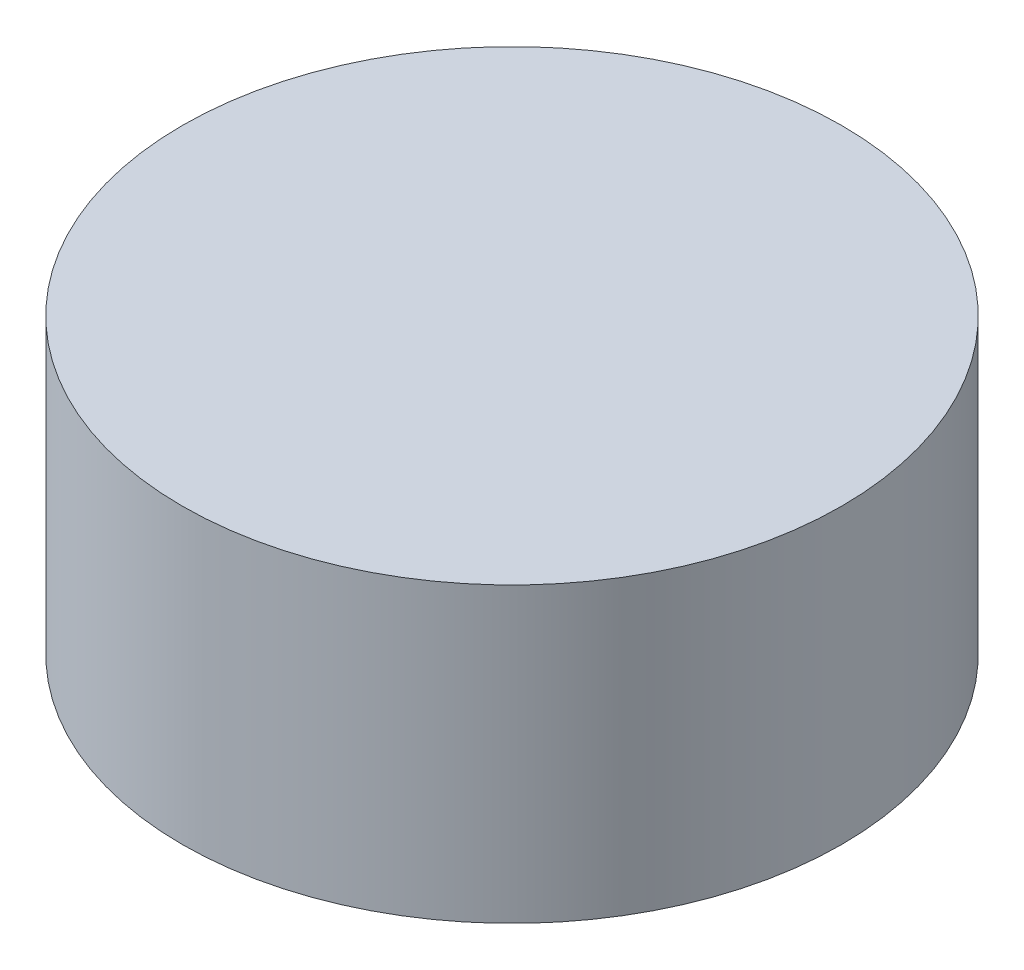
ISO-10303-21;
HEADER;
FILE_DESCRIPTION(('STEP AP214'),'2;1');
FILE_NAME('part.step','',(''),(''),'','','');
FILE_SCHEMA(('AUTOMOTIVE_DESIGN { 1 0 10303 214 1 1 1 1 }'));
ENDSEC;
DATA;
#1=APPLICATION_CONTEXT('core data for automotive mechanical design processes');
#2=APPLICATION_PROTOCOL_DEFINITION('international standard','automotive_design',2000,#1);
#3=PRODUCT_CONTEXT('',#1,'mechanical');
#4=PRODUCT('Part','Part','',(#3));
#5=PRODUCT_RELATED_PRODUCT_CATEGORY('part','',(#4));
#6=PRODUCT_DEFINITION_FORMATION('','',#4);
#7=PRODUCT_DEFINITION_CONTEXT('part definition',#1,'design');
#8=PRODUCT_DEFINITION('design','',#6,#7);
#9=PRODUCT_DEFINITION_SHAPE('','',#8);
#10=(LENGTH_UNIT() NAMED_UNIT(*) SI_UNIT(.MILLI.,.METRE.));
#11=(NAMED_UNIT(*) PLANE_ANGLE_UNIT() SI_UNIT($,.RADIAN.));
#12=(NAMED_UNIT(*) SI_UNIT($,.STERADIAN.) SOLID_ANGLE_UNIT());
#13=UNCERTAINTY_MEASURE_WITH_UNIT(LENGTH_MEASURE(1.E-05),#10,'distance_accuracy_value','');
#14=(GEOMETRIC_REPRESENTATION_CONTEXT(3) GLOBAL_UNCERTAINTY_ASSIGNED_CONTEXT((#13)) GLOBAL_UNIT_ASSIGNED_CONTEXT((#10,
#11,#12)) REPRESENTATION_CONTEXT('',''));
#15=CARTESIAN_POINT('',(0.,0.,0.));
#16=DIRECTION('',(0.,0.,1.));
#17=DIRECTION('',(1.,0.,0.));
#18=AXIS2_PLACEMENT_3D('',#15,#16,#17);
#19=CARTESIAN_POINT('',(0.,8.89,0.));
#20=DIRECTION('',(0.,-1.,0.));
#21=DIRECTION('',(0.,0.,-1.));
#22=AXIS2_PLACEMENT_3D('',#19,#20,#21);
#23=CYLINDRICAL_SURFACE('',#22,50.8);
#24=DIRECTION('',(0.,1.,0.));
#25=VECTOR('',#24,1.);
#26=CARTESIAN_POINT('',(3.81000000000054,1.905,50.656923514955));
#27=LINE('',#26,#25);
#28=CARTESIAN_POINT('',(3.81000000000054,1.905,50.656923514955));
#29=VERTEX_POINT('',#28);
#30=CARTESIAN_POINT('',(3.81000000000054,5.08,50.6569235149549));
#31=VERTEX_POINT('',#30);
#32=EDGE_CURVE('E261',#29,#31,#27,.T.);
#33=ORIENTED_EDGE('',*,*,#32,.T.);
#34=CARTESIAN_POINT('',(0.,5.08,0.));
#35=DIRECTION('',(0.,1.,0.));
#36=DIRECTION('',(0.,0.,-1.));
#37=AXIS2_PLACEMENT_3D('',#34,#35,#36);
#38=CIRCLE('',#37,50.8);
#39=CARTESIAN_POINT('',(50.656923514955,5.08,3.81));
#40=VERTEX_POINT('',#39);
#41=EDGE_CURVE('E259',#31,#40,#38,.T.);
#42=ORIENTED_EDGE('',*,*,#41,.T.);
#43=DIRECTION('',(0.,-1.,0.));
#44=VECTOR('',#43,1.);
#45=CARTESIAN_POINT('',(50.656923514955,8.89,3.81));
#46=LINE('',#45,#44);
#47=CARTESIAN_POINT('',(50.656923514955,0.,3.81));
#48=VERTEX_POINT('',#47);
#49=EDGE_CURVE('E232',#40,#48,#46,.T.);
#50=ORIENTED_EDGE('',*,*,#49,.T.);
#51=CARTESIAN_POINT('',(0.,0.,0.));
#52=DIRECTION('',(0.,-1.,0.));
#53=DIRECTION('',(0.,0.,-1.));
#54=AXIS2_PLACEMENT_3D('',#51,#52,#53);
#55=CIRCLE('',#54,50.8);
#56=CARTESIAN_POINT('',(-50.656923514955,0.,3.81000000000036));
#57=VERTEX_POINT('',#56);
#58=EDGE_CURVE('E205',#48,#57,#55,.T.);
#59=ORIENTED_EDGE('',*,*,#58,.T.);
#60=DIRECTION('',(0.,-1.,0.));
#61=VECTOR('',#60,1.);
#62=CARTESIAN_POINT('',(-50.656923514955,8.89,3.81000000000036));
#63=LINE('',#62,#61);
#64=CARTESIAN_POINT('',(-50.656923514955,8.89,3.81000000000036));
#65=VERTEX_POINT('',#64);
#66=EDGE_CURVE('E230',#65,#57,#63,.T.);
#67=ORIENTED_EDGE('',*,*,#66,.F.);
#68=CARTESIAN_POINT('',(0.,8.89,0.));
#69=DIRECTION('',(0.,-1.,0.));
#70=DIRECTION('',(0.,0.,-1.));
#71=AXIS2_PLACEMENT_3D('',#68,#69,#70);
#72=CIRCLE('',#71,50.8);
#73=CARTESIAN_POINT('',(-3.80999999999946,8.89,50.656923514955));
#74=VERTEX_POINT('',#73);
#75=EDGE_CURVE('E186',#74,#65,#72,.T.);
#76=ORIENTED_EDGE('',*,*,#75,.F.);
#77=DIRECTION('',(0.,1.,0.));
#78=VECTOR('',#77,1.);
#79=CARTESIAN_POINT('',(-3.80999999999946,1.905,50.656923514955));
#80=LINE('',#79,#78);
#81=CARTESIAN_POINT('',(-3.80999999999946,1.905,50.656923514955));
#82=VERTEX_POINT('',#81);
#83=EDGE_CURVE('E48',#82,#74,#80,.T.);
#84=ORIENTED_EDGE('',*,*,#83,.F.);
#85=CARTESIAN_POINT('',(0.,1.905,0.));
#86=DIRECTION('',(0.,1.,0.));
#87=DIRECTION('',(0.,0.,-1.));
#88=AXIS2_PLACEMENT_3D('',#85,#86,#87);
#89=CIRCLE('',#88,50.8);
#90=EDGE_CURVE('E277',#82,#29,#89,.T.);
#91=ORIENTED_EDGE('',*,*,#90,.T.);
#92=EDGE_LOOP('',(#33,#42,#50,#59,#67,#76,#84,#91));
#93=FACE_BOUND('',#92,.T.);
#94=ADVANCED_FACE('F33',(#93),#23,.F.);
#95=CARTESIAN_POINT('',(0.,8.89,0.));
#96=DIRECTION('',(0.,-1.,0.));
#97=DIRECTION('',(0.,0.,-1.));
#98=AXIS2_PLACEMENT_3D('',#95,#96,#97);
#99=CYLINDRICAL_SURFACE('',#98,50.8);
#100=DIRECTION('',(0.,1.,0.));
#101=VECTOR('',#100,1.);
#102=CARTESIAN_POINT('',(-3.81000000000018,1.905,-50.656923514955));
#103=LINE('',#102,#101);
#104=CARTESIAN_POINT('',(-3.81000000000018,1.905,-50.656923514955));
#105=VERTEX_POINT('',#104);
#106=CARTESIAN_POINT('',(-3.81000000000018,5.08,-50.656923514955));
#107=VERTEX_POINT('',#106);
#108=EDGE_CURVE('E171',#105,#107,#103,.T.);
#109=ORIENTED_EDGE('',*,*,#108,.T.);
#110=CARTESIAN_POINT('',(0.,5.08,0.));
#111=DIRECTION('',(0.,1.,0.));
#112=DIRECTION('',(0.,0.,-1.));
#113=AXIS2_PLACEMENT_3D('',#110,#111,#112);
#114=CIRCLE('',#113,50.8);
#115=CARTESIAN_POINT('',(-50.656923514955,5.08,-3.80999999999964));
#116=VERTEX_POINT('',#115);
#117=EDGE_CURVE('E153',#107,#116,#114,.T.);
#118=ORIENTED_EDGE('',*,*,#117,.T.);
#119=DIRECTION('',(0.,-1.,0.));
#120=VECTOR('',#119,1.);
#121=CARTESIAN_POINT('',(-50.656923514955,8.89,-3.80999999999964));
#122=LINE('',#121,#120);
#123=CARTESIAN_POINT('',(-50.656923514955,0.,-3.80999999999964));
#124=VERTEX_POINT('',#123);
#125=EDGE_CURVE('E225',#116,#124,#122,.T.);
#126=ORIENTED_EDGE('',*,*,#125,.T.);
#127=CARTESIAN_POINT('',(0.,0.,0.));
#128=DIRECTION('',(0.,-1.,0.));
#129=DIRECTION('',(0.,0.,-1.));
#130=AXIS2_PLACEMENT_3D('',#127,#128,#129);
#131=CIRCLE('',#130,50.8);
#132=CARTESIAN_POINT('',(50.656923514955,0.,-3.81));
#133=VERTEX_POINT('',#132);
#134=EDGE_CURVE('E216',#124,#133,#131,.T.);
#135=ORIENTED_EDGE('',*,*,#134,.T.);
#136=DIRECTION('',(0.,-1.,0.));
#137=VECTOR('',#136,1.);
#138=CARTESIAN_POINT('',(50.656923514955,8.89,-3.81));
#139=LINE('',#138,#137);
#140=CARTESIAN_POINT('',(50.656923514955,8.89,-3.81));
#141=VERTEX_POINT('',#140);
#142=EDGE_CURVE('E223',#141,#133,#139,.T.);
#143=ORIENTED_EDGE('',*,*,#142,.F.);
#144=CARTESIAN_POINT('',(0.,8.89,0.));
#145=DIRECTION('',(0.,-1.,0.));
#146=DIRECTION('',(0.,0.,-1.));
#147=AXIS2_PLACEMENT_3D('',#144,#145,#146);
#148=CIRCLE('',#147,50.8);
#149=CARTESIAN_POINT('',(3.80999999999982,8.89,-50.656923514955));
#150=VERTEX_POINT('',#149);
#151=EDGE_CURVE('E194',#150,#141,#148,.T.);
#152=ORIENTED_EDGE('',*,*,#151,.F.);
#153=DIRECTION('',(0.,1.,0.));
#154=VECTOR('',#153,1.);
#155=CARTESIAN_POINT('',(3.80999999999982,1.905,-50.656923514955));
#156=LINE('',#155,#154);
#157=CARTESIAN_POINT('',(3.80999999999982,1.905,-50.656923514955));
#158=VERTEX_POINT('',#157);
#159=EDGE_CURVE('E56',#158,#150,#156,.T.);
#160=ORIENTED_EDGE('',*,*,#159,.F.);
#161=CARTESIAN_POINT('',(0.,1.905,0.));
#162=DIRECTION('',(0.,1.,0.));
#163=DIRECTION('',(0.,0.,-1.));
#164=AXIS2_PLACEMENT_3D('',#161,#162,#163);
#165=CIRCLE('',#164,50.8);
#166=EDGE_CURVE('E174',#158,#105,#165,.T.);
#167=ORIENTED_EDGE('',*,*,#166,.T.);
#168=EDGE_LOOP('',(#109,#118,#126,#135,#143,#152,#160,#167));
#169=FACE_BOUND('',#168,.T.);
#170=ADVANCED_FACE('F297',(#169),#99,.F.);
#171=CARTESIAN_POINT('',(0.,50.8,0.));
#172=DIRECTION('',(0.,-1.,0.));
#173=DIRECTION('',(0.,0.,-1.));
#174=AXIS2_PLACEMENT_3D('',#171,#172,#173);
#175=CYLINDRICAL_SURFACE('',#174,57.15);
#176=CARTESIAN_POINT('',(0.,50.8,0.));
#177=DIRECTION('',(0.,1.,0.));
#178=DIRECTION('',(0.,0.,1.));
#179=AXIS2_PLACEMENT_3D('',#176,#177,#178);
#180=CIRCLE('',#179,57.15);
#181=CARTESIAN_POINT('',(0.,50.8,57.15));
#182=VERTEX_POINT('',#181);
#183=EDGE_CURVE('E11',#182,#182,#180,.T.);
#184=ORIENTED_EDGE('',*,*,#183,.F.);
#185=EDGE_LOOP('',(#184));
#186=FACE_BOUND('',#185,.T.);
#187=CARTESIAN_POINT('',(0.,0.,0.));
#188=DIRECTION('',(0.,1.,0.));
#189=DIRECTION('',(0.,0.,1.));
#190=AXIS2_PLACEMENT_3D('',#187,#188,#189);
#191=CIRCLE('',#190,57.15);
#192=CARTESIAN_POINT('',(0.,0.,57.15));
#193=VERTEX_POINT('',#192);
#194=EDGE_CURVE('E37',#193,#193,#191,.T.);
#195=ORIENTED_EDGE('',*,*,#194,.T.);
#196=EDGE_LOOP('',(#195));
#197=FACE_BOUND('',#196,.T.);
#198=ADVANCED_FACE('F35',(#186,#197),#175,.T.);
#199=CARTESIAN_POINT('',(0.,50.8,0.));
#200=DIRECTION('',(0.,1.,0.));
#201=DIRECTION('',(0.,0.,1.));
#202=AXIS2_PLACEMENT_3D('',#199,#200,#201);
#203=PLANE('',#202);
#204=ORIENTED_EDGE('',*,*,#183,.T.);
#205=EDGE_LOOP('',(#204));
#206=FACE_BOUND('',#205,.T.);
#207=ADVANCED_FACE('F352',(#206),#203,.T.);
#208=CARTESIAN_POINT('',(0.,0.,0.));
#209=DIRECTION('',(0.,1.,0.));
#210=DIRECTION('',(0.,0.,1.));
#211=AXIS2_PLACEMENT_3D('',#208,#209,#210);
#212=PLANE('',#211);
#213=DIRECTION('',(-1.,0.,0.));
#214=VECTOR('',#213,1.);
#215=CARTESIAN_POINT('',(55.7499623318258,0.,3.81));
#216=LINE('',#215,#214);
#217=CARTESIAN_POINT('',(55.7499623318258,0.,3.81));
#218=VERTEX_POINT('',#217);
#219=EDGE_CURVE('E202',#218,#48,#216,.T.);
#220=ORIENTED_EDGE('',*,*,#219,.F.);
#221=CARTESIAN_POINT('',(0.,0.,0.));
#222=DIRECTION('',(0.,-1.,0.));
#223=DIRECTION('',(0.,0.,-1.));
#224=AXIS2_PLACEMENT_3D('',#221,#222,#223);
#225=CIRCLE('',#224,55.88);
#226=CARTESIAN_POINT('',(55.7499623318258,0.,-3.81));
#227=VERTEX_POINT('',#226);
#228=EDGE_CURVE('E183',#227,#218,#225,.T.);
#229=ORIENTED_EDGE('',*,*,#228,.F.);
#230=DIRECTION('',(1.,0.,0.));
#231=VECTOR('',#230,1.);
#232=CARTESIAN_POINT('',(55.7499623318258,0.,-3.81));
#233=LINE('',#232,#231);
#234=EDGE_CURVE('E187',#133,#227,#233,.T.);
#235=ORIENTED_EDGE('',*,*,#234,.F.);
#236=ORIENTED_EDGE('',*,*,#134,.F.);
#237=DIRECTION('',(1.,0.,0.));
#238=VECTOR('',#237,1.);
#239=CARTESIAN_POINT('',(-55.7499623318259,0.,-3.80999999999961));
#240=LINE('',#239,#238);
#241=CARTESIAN_POINT('',(-55.7499623318259,0.,-3.80999999999957));
#242=VERTEX_POINT('',#241);
#243=EDGE_CURVE('E213',#242,#124,#240,.T.);
#244=ORIENTED_EDGE('',*,*,#243,.F.);
#245=CARTESIAN_POINT('',(0.,0.,0.));
#246=DIRECTION('',(0.,-1.,0.));
#247=DIRECTION('',(0.,0.,-1.));
#248=AXIS2_PLACEMENT_3D('',#245,#246,#247);
#249=CIRCLE('',#248,55.88);
#250=CARTESIAN_POINT('',(-55.7499623318258,0.,3.81000000000039));
#251=VERTEX_POINT('',#250);
#252=EDGE_CURVE('E211',#251,#242,#249,.T.);
#253=ORIENTED_EDGE('',*,*,#252,.F.);
#254=DIRECTION('',(-1.,0.,0.));
#255=VECTOR('',#254,1.);
#256=CARTESIAN_POINT('',(-55.7499623318258,0.,3.81000000000039));
#257=LINE('',#256,#255);
#258=EDGE_CURVE('E208',#57,#251,#257,.T.);
#259=ORIENTED_EDGE('',*,*,#258,.F.);
#260=ORIENTED_EDGE('',*,*,#58,.F.);
#261=EDGE_LOOP('',(#220,#229,#235,#236,#244,#253,#259,#260));
#262=FACE_BOUND('',#261,.T.);
#263=ORIENTED_EDGE('',*,*,#194,.F.);
#264=EDGE_LOOP('',(#263));
#265=FACE_BOUND('',#264,.T.);
#266=ADVANCED_FACE('F249',(#262,#265),#212,.F.);
#267=CARTESIAN_POINT('',(0.,8.89,0.));
#268=DIRECTION('',(0.,-1.,0.));
#269=DIRECTION('',(0.,0.,-1.));
#270=AXIS2_PLACEMENT_3D('',#267,#268,#269);
#271=CYLINDRICAL_SURFACE('',#270,55.88);
#272=ORIENTED_EDGE('',*,*,#228,.T.);
#273=DIRECTION('',(0.,-1.,0.));
#274=VECTOR('',#273,1.);
#275=CARTESIAN_POINT('',(55.7499623318258,8.89,3.81));
#276=LINE('',#275,#274);
#277=CARTESIAN_POINT('',(55.7499623318258,5.08,3.81));
#278=VERTEX_POINT('',#277);
#279=EDGE_CURVE('E199',#278,#218,#276,.T.);
#280=ORIENTED_EDGE('',*,*,#279,.F.);
#281=CARTESIAN_POINT('',(0.,5.08,0.));
#282=DIRECTION('',(0.,-1.,0.));
#283=DIRECTION('',(0.,0.,-1.));
#284=AXIS2_PLACEMENT_3D('',#281,#282,#283);
#285=CIRCLE('',#284,55.88);
#286=CARTESIAN_POINT('',(3.81000000000059,5.08,55.7499623318258));
#287=VERTEX_POINT('',#286);
#288=EDGE_CURVE('E268',#278,#287,#285,.T.);
#289=ORIENTED_EDGE('',*,*,#288,.T.);
#290=DIRECTION('',(0.,1.,0.));
#291=VECTOR('',#290,1.);
#292=CARTESIAN_POINT('',(3.81000000000059,1.905,55.7499623318258));
#293=LINE('',#292,#291);
#294=CARTESIAN_POINT('',(3.81000000000059,1.905,55.7499623318258));
#295=VERTEX_POINT('',#294);
#296=EDGE_CURVE('E281',#295,#287,#293,.T.);
#297=ORIENTED_EDGE('',*,*,#296,.F.);
#298=CARTESIAN_POINT('',(0.,1.905,0.));
#299=DIRECTION('',(0.,-1.,0.));
#300=DIRECTION('',(0.,0.,-1.));
#301=AXIS2_PLACEMENT_3D('',#298,#299,#300);
#302=CIRCLE('',#301,55.88);
#303=CARTESIAN_POINT('',(-3.80999999999941,1.905,55.7499623318259));
#304=VERTEX_POINT('',#303);
#305=EDGE_CURVE('E272',#295,#304,#302,.T.);
#306=ORIENTED_EDGE('',*,*,#305,.T.);
#307=DIRECTION('',(0.,1.,0.));
#308=VECTOR('',#307,1.);
#309=CARTESIAN_POINT('',(-3.80999999999941,1.905,55.7499623318259));
#310=LINE('',#309,#308);
#311=CARTESIAN_POINT('',(-3.80999999999941,8.89,55.7499623318259));
#312=VERTEX_POINT('',#311);
#313=EDGE_CURVE('E287',#304,#312,#310,.T.);
#314=ORIENTED_EDGE('',*,*,#313,.T.);
#315=CARTESIAN_POINT('',(0.,8.89,0.));
#316=DIRECTION('',(0.,-1.,0.));
#317=DIRECTION('',(0.,0.,-1.));
#318=AXIS2_PLACEMENT_3D('',#315,#316,#317);
#319=CIRCLE('',#318,55.88);
#320=CARTESIAN_POINT('',(55.7499623318258,8.89,-3.81));
#321=VERTEX_POINT('',#320);
#322=EDGE_CURVE('E184',#321,#312,#319,.T.);
#323=ORIENTED_EDGE('',*,*,#322,.F.);
#324=DIRECTION('',(0.,-1.,0.));
#325=VECTOR('',#324,1.);
#326=CARTESIAN_POINT('',(55.7499623318258,8.89,-3.81));
#327=LINE('',#326,#325);
#328=EDGE_CURVE('E221',#321,#227,#327,.T.);
#329=ORIENTED_EDGE('',*,*,#328,.T.);
#330=EDGE_LOOP('',(#272,#280,#289,#297,#306,#314,#323,#329));
#331=FACE_BOUND('',#330,.T.);
#332=ADVANCED_FACE('F245',(#331),#271,.F.);
#333=CARTESIAN_POINT('',(55.7499623318258,8.89,-3.81));
#334=DIRECTION('',(0.,0.,-1.));
#335=DIRECTION('',(-1.,0.,0.));
#336=AXIS2_PLACEMENT_3D('',#333,#334,#335);
#337=PLANE('',#336);
#338=ORIENTED_EDGE('',*,*,#234,.T.);
#339=ORIENTED_EDGE('',*,*,#328,.F.);
#340=DIRECTION('',(1.,0.,0.));
#341=VECTOR('',#340,1.);
#342=CARTESIAN_POINT('',(55.7499623318258,8.89,-3.81));
#343=LINE('',#342,#341);
#344=EDGE_CURVE('E196',#141,#321,#343,.T.);
#345=ORIENTED_EDGE('',*,*,#344,.F.);
#346=ORIENTED_EDGE('',*,*,#142,.T.);
#347=EDGE_LOOP('',(#338,#339,#345,#346));
#348=FACE_BOUND('',#347,.T.);
#349=ADVANCED_FACE('F310',(#348),#337,.F.);
#350=CARTESIAN_POINT('',(-55.7499623318259,8.89,-3.80999999999961));
#351=DIRECTION('',(0.,0.,-1.));
#352=DIRECTION('',(-1.,0.,0.));
#353=AXIS2_PLACEMENT_3D('',#350,#351,#352);
#354=PLANE('',#353);
#355=ORIENTED_EDGE('',*,*,#125,.F.);
#356=DIRECTION('',(-1.,0.,0.));
#357=VECTOR('',#356,1.);
#358=CARTESIAN_POINT('',(-55.7499623318259,5.08,-3.80999999999957));
#359=LINE('',#358,#357);
#360=CARTESIAN_POINT('',(-55.7499623318259,5.08,-3.80999999999957));
#361=VERTEX_POINT('',#360);
#362=EDGE_CURVE('E325',#116,#361,#359,.T.);
#363=ORIENTED_EDGE('',*,*,#362,.T.);
#364=DIRECTION('',(0.,-1.,0.));
#365=VECTOR('',#364,1.);
#366=CARTESIAN_POINT('',(-55.7499623318259,8.89,-3.80999999999957));
#367=LINE('',#366,#365);
#368=EDGE_CURVE('E166',#361,#242,#367,.T.);
#369=ORIENTED_EDGE('',*,*,#368,.T.);
#370=ORIENTED_EDGE('',*,*,#243,.T.);
#371=EDGE_LOOP('',(#355,#363,#369,#370));
#372=FACE_BOUND('',#371,.T.);
#373=ADVANCED_FACE('F324',(#372),#354,.F.);
#374=CARTESIAN_POINT('',(0.,8.89,0.));
#375=DIRECTION('',(0.,-1.,0.));
#376=DIRECTION('',(0.,0.,-1.));
#377=AXIS2_PLACEMENT_3D('',#374,#375,#376);
#378=CYLINDRICAL_SURFACE('',#377,55.88);
#379=ORIENTED_EDGE('',*,*,#252,.T.);
#380=ORIENTED_EDGE('',*,*,#368,.F.);
#381=CARTESIAN_POINT('',(0.,5.08,0.));
#382=DIRECTION('',(0.,-1.,0.));
#383=DIRECTION('',(0.,0.,-1.));
#384=AXIS2_PLACEMENT_3D('',#381,#382,#383);
#385=CIRCLE('',#384,55.88);
#386=CARTESIAN_POINT('',(-3.81000000000019,5.08,-55.7499623318258));
#387=VERTEX_POINT('',#386);
#388=EDGE_CURVE('E150',#361,#387,#385,.T.);
#389=ORIENTED_EDGE('',*,*,#388,.T.);
#390=DIRECTION('',(0.,1.,0.));
#391=VECTOR('',#390,1.);
#392=CARTESIAN_POINT('',(-3.81000000000019,1.905,-55.7499623318258));
#393=LINE('',#392,#391);
#394=CARTESIAN_POINT('',(-3.81000000000019,1.905,-55.7499623318258));
#395=VERTEX_POINT('',#394);
#396=EDGE_CURVE('E164',#395,#387,#393,.T.);
#397=ORIENTED_EDGE('',*,*,#396,.F.);
#398=CARTESIAN_POINT('',(0.,1.905,0.));
#399=DIRECTION('',(0.,-1.,0.));
#400=DIRECTION('',(0.,0.,-1.));
#401=AXIS2_PLACEMENT_3D('',#398,#399,#400);
#402=CIRCLE('',#401,55.88);
#403=CARTESIAN_POINT('',(3.8099999999998,1.905,-55.7499623318259));
#404=VERTEX_POINT('',#403);
#405=EDGE_CURVE('E290',#395,#404,#402,.T.);
#406=ORIENTED_EDGE('',*,*,#405,.T.);
#407=DIRECTION('',(0.,1.,0.));
#408=VECTOR('',#407,1.);
#409=CARTESIAN_POINT('',(3.8099999999998,1.905,-55.7499623318259));
#410=LINE('',#409,#408);
#411=CARTESIAN_POINT('',(3.8099999999998,8.89,-55.7499623318259));
#412=VERTEX_POINT('',#411);
#413=EDGE_CURVE('E180',#404,#412,#410,.T.);
#414=ORIENTED_EDGE('',*,*,#413,.T.);
#415=CARTESIAN_POINT('',(0.,8.89,0.));
#416=DIRECTION('',(0.,-1.,0.));
#417=DIRECTION('',(0.,0.,-1.));
#418=AXIS2_PLACEMENT_3D('',#415,#416,#417);
#419=CIRCLE('',#418,55.88);
#420=CARTESIAN_POINT('',(-55.7499623318258,8.89,3.81000000000039));
#421=VERTEX_POINT('',#420);
#422=EDGE_CURVE('E192',#421,#412,#419,.T.);
#423=ORIENTED_EDGE('',*,*,#422,.F.);
#424=DIRECTION('',(0.,-1.,0.));
#425=VECTOR('',#424,1.);
#426=CARTESIAN_POINT('',(-55.7499623318258,8.89,3.81000000000039));
#427=LINE('',#426,#425);
#428=EDGE_CURVE('E228',#421,#251,#427,.T.);
#429=ORIENTED_EDGE('',*,*,#428,.T.);
#430=EDGE_LOOP('',(#379,#380,#389,#397,#406,#414,#423,#429));
#431=FACE_BOUND('',#430,.T.);
#432=ADVANCED_FACE('F162',(#431),#378,.F.);
#433=CARTESIAN_POINT('',(-55.7499623318258,8.89,3.81000000000039));
#434=DIRECTION('',(0.,0.,1.));
#435=DIRECTION('',(1.,0.,0.));
#436=AXIS2_PLACEMENT_3D('',#433,#434,#435);
#437=PLANE('',#436);
#438=ORIENTED_EDGE('',*,*,#258,.T.);
#439=ORIENTED_EDGE('',*,*,#428,.F.);
#440=DIRECTION('',(-1.,0.,0.));
#441=VECTOR('',#440,1.);
#442=CARTESIAN_POINT('',(-55.7499623318258,8.89,3.81000000000039));
#443=LINE('',#442,#441);
#444=EDGE_CURVE('E189',#65,#421,#443,.T.);
#445=ORIENTED_EDGE('',*,*,#444,.F.);
#446=ORIENTED_EDGE('',*,*,#66,.T.);
#447=EDGE_LOOP('',(#438,#439,#445,#446));
#448=FACE_BOUND('',#447,.T.);
#449=ADVANCED_FACE('F320',(#448),#437,.F.);
#450=CARTESIAN_POINT('',(55.7499623318258,8.89,3.81));
#451=DIRECTION('',(0.,0.,1.));
#452=DIRECTION('',(1.,0.,0.));
#453=AXIS2_PLACEMENT_3D('',#450,#451,#452);
#454=PLANE('',#453);
#455=ORIENTED_EDGE('',*,*,#49,.F.);
#456=DIRECTION('',(1.,0.,0.));
#457=VECTOR('',#456,1.);
#458=CARTESIAN_POINT('',(55.7499623318258,5.08,3.81));
#459=LINE('',#458,#457);
#460=EDGE_CURVE('E241',#40,#278,#459,.T.);
#461=ORIENTED_EDGE('',*,*,#460,.T.);
#462=ORIENTED_EDGE('',*,*,#279,.T.);
#463=ORIENTED_EDGE('',*,*,#219,.T.);
#464=EDGE_LOOP('',(#455,#461,#462,#463));
#465=FACE_BOUND('',#464,.T.);
#466=ADVANCED_FACE('F238',(#465),#454,.F.);
#467=CARTESIAN_POINT('',(0.,8.89,0.));
#468=DIRECTION('',(0.,-1.,0.));
#469=DIRECTION('',(0.,0.,-1.));
#470=AXIS2_PLACEMENT_3D('',#467,#468,#469);
#471=PLANE('',#470);
#472=ORIENTED_EDGE('',*,*,#322,.T.);
#473=DIRECTION('',(0.,0.,-1.));
#474=VECTOR('',#473,1.);
#475=CARTESIAN_POINT('',(-3.80999999999941,8.89,55.7499623318259));
#476=LINE('',#475,#474);
#477=EDGE_CURVE('E266',#312,#74,#476,.T.);
#478=ORIENTED_EDGE('',*,*,#477,.T.);
#479=ORIENTED_EDGE('',*,*,#75,.T.);
#480=ORIENTED_EDGE('',*,*,#444,.T.);
#481=ORIENTED_EDGE('',*,*,#422,.T.);
#482=DIRECTION('',(0.,0.,1.));
#483=VECTOR('',#482,1.);
#484=CARTESIAN_POINT('',(3.8099999999998,8.89,-55.7499623318259));
#485=LINE('',#484,#483);
#486=EDGE_CURVE('E177',#412,#150,#485,.T.);
#487=ORIENTED_EDGE('',*,*,#486,.T.);
#488=ORIENTED_EDGE('',*,*,#151,.T.);
#489=ORIENTED_EDGE('',*,*,#344,.T.);
#490=EDGE_LOOP('',(#472,#478,#479,#480,#481,#487,#488,#489));
#491=FACE_BOUND('',#490,.T.);
#492=ADVANCED_FACE('F305',(#491),#471,.T.);
#493=CARTESIAN_POINT('',(3.8099999999998,1.905,-55.7499623318259));
#494=DIRECTION('',(-1.,0.,0.));
#495=DIRECTION('',(0.,0.,1.));
#496=AXIS2_PLACEMENT_3D('',#493,#494,#495);
#497=PLANE('',#496);
#498=ORIENTED_EDGE('',*,*,#486,.F.);
#499=ORIENTED_EDGE('',*,*,#413,.F.);
#500=DIRECTION('',(0.,0.,1.));
#501=VECTOR('',#500,1.);
#502=CARTESIAN_POINT('',(3.8099999999998,1.905,-55.7499623318259));
#503=LINE('',#502,#501);
#504=EDGE_CURVE('E292',#404,#158,#503,.T.);
#505=ORIENTED_EDGE('',*,*,#504,.T.);
#506=ORIENTED_EDGE('',*,*,#159,.T.);
#507=EDGE_LOOP('',(#498,#499,#505,#506));
#508=FACE_BOUND('',#507,.T.);
#509=ADVANCED_FACE('F303',(#508),#497,.T.);
#510=CARTESIAN_POINT('',(-3.81000000000017,1.905,-50.656923514955));
#511=DIRECTION('',(1.,0.,0.));
#512=DIRECTION('',(0.,0.,-1.));
#513=AXIS2_PLACEMENT_3D('',#510,#511,#512);
#514=PLANE('',#513);
#515=DIRECTION('',(0.,0.,1.));
#516=VECTOR('',#515,1.);
#517=CARTESIAN_POINT('',(-3.81000000000018,5.08,-50.656923514955));
#518=LINE('',#517,#516);
#519=EDGE_CURVE('E147',#387,#107,#518,.T.);
#520=ORIENTED_EDGE('',*,*,#519,.T.);
#521=ORIENTED_EDGE('',*,*,#108,.F.);
#522=DIRECTION('',(0.,0.,-1.));
#523=VECTOR('',#522,1.);
#524=CARTESIAN_POINT('',(-3.81000000000017,1.905,-50.656923514955));
#525=LINE('',#524,#523);
#526=EDGE_CURVE('E170',#105,#395,#525,.T.);
#527=ORIENTED_EDGE('',*,*,#526,.T.);
#528=ORIENTED_EDGE('',*,*,#396,.T.);
#529=EDGE_LOOP('',(#520,#521,#527,#528));
#530=FACE_BOUND('',#529,.T.);
#531=ADVANCED_FACE('F168',(#530),#514,.T.);
#532=CARTESIAN_POINT('',(0.,1.905,0.));
#533=DIRECTION('',(0.,-1.,0.));
#534=DIRECTION('',(0.,0.,-1.));
#535=AXIS2_PLACEMENT_3D('',#532,#533,#534);
#536=PLANE('',#535);
#537=ORIENTED_EDGE('',*,*,#405,.F.);
#538=ORIENTED_EDGE('',*,*,#526,.F.);
#539=ORIENTED_EDGE('',*,*,#166,.F.);
#540=ORIENTED_EDGE('',*,*,#504,.F.);
#541=EDGE_LOOP('',(#537,#538,#539,#540));
#542=FACE_BOUND('',#541,.T.);
#543=ADVANCED_FACE('F300',(#542),#536,.F.);
#544=CARTESIAN_POINT('',(-3.80999999999941,1.905,55.7499623318259));
#545=DIRECTION('',(1.,0.,0.));
#546=DIRECTION('',(0.,0.,-1.));
#547=AXIS2_PLACEMENT_3D('',#544,#545,#546);
#548=PLANE('',#547);
#549=ORIENTED_EDGE('',*,*,#477,.F.);
#550=ORIENTED_EDGE('',*,*,#313,.F.);
#551=DIRECTION('',(0.,0.,-1.));
#552=VECTOR('',#551,1.);
#553=CARTESIAN_POINT('',(-3.80999999999941,1.905,55.7499623318259));
#554=LINE('',#553,#552);
#555=EDGE_CURVE('E275',#304,#82,#554,.T.);
#556=ORIENTED_EDGE('',*,*,#555,.T.);
#557=ORIENTED_EDGE('',*,*,#83,.T.);
#558=EDGE_LOOP('',(#549,#550,#556,#557));
#559=FACE_BOUND('',#558,.T.);
#560=ADVANCED_FACE('F312',(#559),#548,.T.);
#561=CARTESIAN_POINT('',(3.81000000000053,1.905,50.656923514955));
#562=DIRECTION('',(-1.,0.,0.));
#563=DIRECTION('',(0.,0.,1.));
#564=AXIS2_PLACEMENT_3D('',#561,#562,#563);
#565=PLANE('',#564);
#566=DIRECTION('',(0.,0.,-1.));
#567=VECTOR('',#566,1.);
#568=CARTESIAN_POINT('',(3.81000000000054,5.08,50.656923514955));
#569=LINE('',#568,#567);
#570=EDGE_CURVE('E264',#287,#31,#569,.T.);
#571=ORIENTED_EDGE('',*,*,#570,.T.);
#572=ORIENTED_EDGE('',*,*,#32,.F.);
#573=DIRECTION('',(0.,0.,1.));
#574=VECTOR('',#573,1.);
#575=CARTESIAN_POINT('',(3.81000000000053,1.905,50.656923514955));
#576=LINE('',#575,#574);
#577=EDGE_CURVE('E279',#29,#295,#576,.T.);
#578=ORIENTED_EDGE('',*,*,#577,.T.);
#579=ORIENTED_EDGE('',*,*,#296,.T.);
#580=EDGE_LOOP('',(#571,#572,#578,#579));
#581=FACE_BOUND('',#580,.T.);
#582=ADVANCED_FACE('F329',(#581),#565,.T.);
#583=CARTESIAN_POINT('',(0.,1.905,0.));
#584=DIRECTION('',(0.,-1.,0.));
#585=DIRECTION('',(0.,0.,-1.));
#586=AXIS2_PLACEMENT_3D('',#583,#584,#585);
#587=PLANE('',#586);
#588=ORIENTED_EDGE('',*,*,#305,.F.);
#589=ORIENTED_EDGE('',*,*,#577,.F.);
#590=ORIENTED_EDGE('',*,*,#90,.F.);
#591=ORIENTED_EDGE('',*,*,#555,.F.);
#592=EDGE_LOOP('',(#588,#589,#590,#591));
#593=FACE_BOUND('',#592,.T.);
#594=ADVANCED_FACE('F317',(#593),#587,.F.);
#595=CARTESIAN_POINT('',(0.,5.08,0.));
#596=DIRECTION('',(0.,-1.,0.));
#597=DIRECTION('',(0.,0.,-1.));
#598=AXIS2_PLACEMENT_3D('',#595,#596,#597);
#599=PLANE('',#598);
#600=ORIENTED_EDGE('',*,*,#288,.F.);
#601=ORIENTED_EDGE('',*,*,#460,.F.);
#602=ORIENTED_EDGE('',*,*,#41,.F.);
#603=ORIENTED_EDGE('',*,*,#570,.F.);
#604=EDGE_LOOP('',(#600,#601,#602,#603));
#605=FACE_BOUND('',#604,.T.);
#606=ADVANCED_FACE('F330',(#605),#599,.F.);
#607=CARTESIAN_POINT('',(0.,5.08,0.));
#608=DIRECTION('',(0.,-1.,0.));
#609=DIRECTION('',(0.,0.,-1.));
#610=AXIS2_PLACEMENT_3D('',#607,#608,#609);
#611=PLANE('',#610);
#612=ORIENTED_EDGE('',*,*,#388,.F.);
#613=ORIENTED_EDGE('',*,*,#362,.F.);
#614=ORIENTED_EDGE('',*,*,#117,.F.);
#615=ORIENTED_EDGE('',*,*,#519,.F.);
#616=EDGE_LOOP('',(#612,#613,#614,#615));
#617=FACE_BOUND('',#616,.T.);
#618=ADVANCED_FACE('F149',(#617),#611,.F.);
#619=CLOSED_SHELL('',(#94,#170,#198,#207,#266,#332,#349,#373,#432,#449,#466,#492,#509,#531,#543,
#560,#582,#594,#606,#618));
#620=MANIFOLD_SOLID_BREP('B2',#619);
#621=ADVANCED_BREP_SHAPE_REPRESENTATION('',(#18,#620),#14);
#622=SHAPE_DEFINITION_REPRESENTATION(#9,#621);
ENDSEC;
END-ISO-10303-21;
